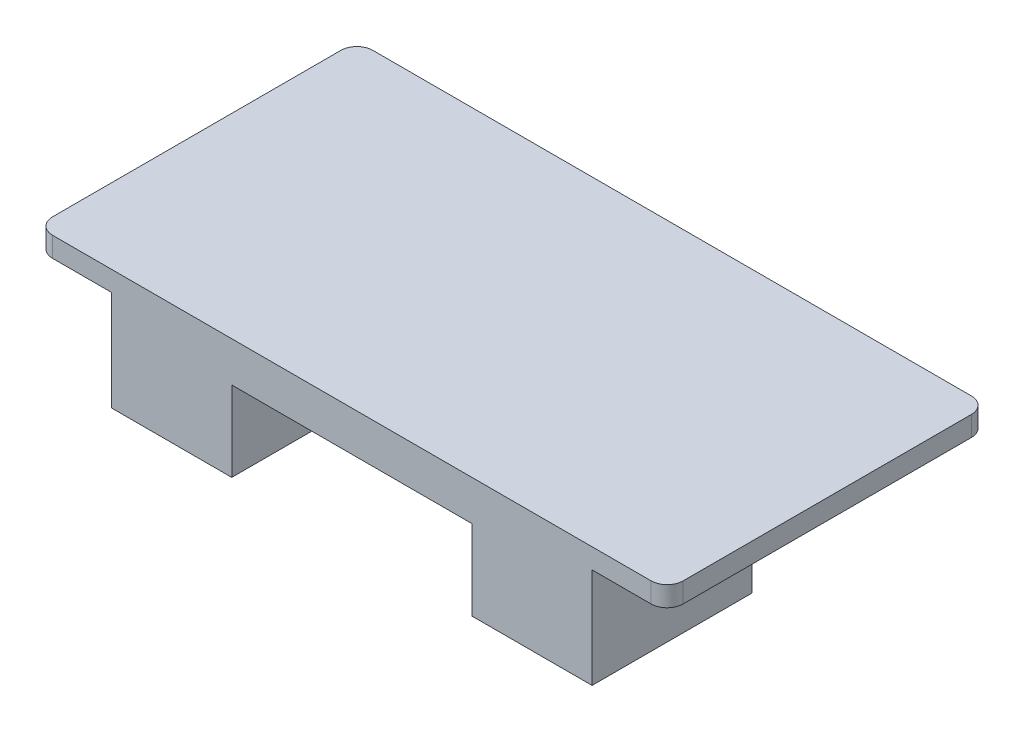
ISO-10303-21;
HEADER;
FILE_DESCRIPTION(('STEP AP214'),'2;1');
FILE_NAME('part.step','',(''),(''),'','','');
FILE_SCHEMA(('AUTOMOTIVE_DESIGN { 1 0 10303 214 1 1 1 1 }'));
ENDSEC;
DATA;
#1=APPLICATION_CONTEXT('core data for automotive mechanical design processes');
#2=APPLICATION_PROTOCOL_DEFINITION('international standard','automotive_design',2000,#1);
#3=PRODUCT_CONTEXT('',#1,'mechanical');
#4=PRODUCT('Part','Part','',(#3));
#5=PRODUCT_RELATED_PRODUCT_CATEGORY('part','',(#4));
#6=PRODUCT_DEFINITION_FORMATION('','',#4);
#7=PRODUCT_DEFINITION_CONTEXT('part definition',#1,'design');
#8=PRODUCT_DEFINITION('design','',#6,#7);
#9=PRODUCT_DEFINITION_SHAPE('','',#8);
#10=(LENGTH_UNIT() NAMED_UNIT(*) SI_UNIT(.MILLI.,.METRE.));
#11=(NAMED_UNIT(*) PLANE_ANGLE_UNIT() SI_UNIT($,.RADIAN.));
#12=(NAMED_UNIT(*) SI_UNIT($,.STERADIAN.) SOLID_ANGLE_UNIT());
#13=UNCERTAINTY_MEASURE_WITH_UNIT(LENGTH_MEASURE(1.E-05),#10,'distance_accuracy_value','');
#14=(GEOMETRIC_REPRESENTATION_CONTEXT(3) GLOBAL_UNCERTAINTY_ASSIGNED_CONTEXT((#13)) GLOBAL_UNIT_ASSIGNED_CONTEXT((#10,
#11,#12)) REPRESENTATION_CONTEXT('',''));
#15=CARTESIAN_POINT('',(0.,0.,0.));
#16=DIRECTION('',(0.,0.,1.));
#17=DIRECTION('',(1.,0.,0.));
#18=AXIS2_PLACEMENT_3D('',#15,#16,#17);
#19=CARTESIAN_POINT('',(0.,0.,0.));
#20=DIRECTION('',(0.,1.,0.));
#21=DIRECTION('',(0.,0.,1.));
#22=AXIS2_PLACEMENT_3D('',#19,#20,#21);
#23=PLANE('',#22);
#24=CARTESIAN_POINT('',(-52.5,0.,11.75));
#25=DIRECTION('',(0.,1.,0.));
#26=DIRECTION('',(0.,0.,1.));
#27=AXIS2_PLACEMENT_3D('',#24,#25,#26);
#28=CIRCLE('',#27,3.25);
#29=CARTESIAN_POINT('',(-52.5,0.,15.));
#30=VERTEX_POINT('',#29);
#31=EDGE_CURVE('E57',#30,#30,#28,.T.);
#32=ORIENTED_EDGE('',*,*,#31,.T.);
#33=EDGE_LOOP('',(#32));
#34=FACE_BOUND('',#33,.T.);
#35=CARTESIAN_POINT('',(-52.5,0.,-11.75));
#36=DIRECTION('',(0.,1.,0.));
#37=DIRECTION('',(0.,0.,1.));
#38=AXIS2_PLACEMENT_3D('',#35,#36,#37);
#39=CIRCLE('',#38,3.25);
#40=CARTESIAN_POINT('',(-52.5,0.,-8.5));
#41=VERTEX_POINT('',#40);
#42=EDGE_CURVE('E370',#41,#41,#39,.T.);
#43=ORIENTED_EDGE('',*,*,#42,.T.);
#44=EDGE_LOOP('',(#43));
#45=FACE_BOUND('',#44,.T.);
#46=DIRECTION('',(-1.,0.,0.));
#47=VECTOR('',#46,1.);
#48=CARTESIAN_POINT('',(-60.,0.,-20.));
#49=LINE('',#48,#47);
#50=CARTESIAN_POINT('',(-30.,0.,-20.));
#51=VERTEX_POINT('',#50);
#52=CARTESIAN_POINT('',(-60.,0.,-20.));
#53=VERTEX_POINT('',#52);
#54=EDGE_CURVE('E282',#51,#53,#49,.T.);
#55=ORIENTED_EDGE('',*,*,#54,.F.);
#56=DIRECTION('',(0.,0.,-1.));
#57=VECTOR('',#56,1.);
#58=CARTESIAN_POINT('',(-30.,0.,20.));
#59=LINE('',#58,#57);
#60=CARTESIAN_POINT('',(-30.,0.,20.));
#61=VERTEX_POINT('',#60);
#62=EDGE_CURVE('E169',#61,#51,#59,.T.);
#63=ORIENTED_EDGE('',*,*,#62,.F.);
#64=DIRECTION('',(1.,0.,0.));
#65=VECTOR('',#64,1.);
#66=CARTESIAN_POINT('',(-60.,0.,20.));
#67=LINE('',#66,#65);
#68=CARTESIAN_POINT('',(-60.,0.,20.));
#69=VERTEX_POINT('',#68);
#70=EDGE_CURVE('E275',#69,#61,#67,.T.);
#71=ORIENTED_EDGE('',*,*,#70,.F.);
#72=DIRECTION('',(0.,0.,1.));
#73=VECTOR('',#72,1.);
#74=CARTESIAN_POINT('',(-60.,0.,-20.));
#75=LINE('',#74,#73);
#76=EDGE_CURVE('E256',#53,#69,#75,.T.);
#77=ORIENTED_EDGE('',*,*,#76,.F.);
#78=EDGE_LOOP('',(#55,#63,#71,#77));
#79=FACE_BOUND('',#78,.T.);
#80=ADVANCED_FACE('F47',(#34,#45,#79),#23,.F.);
#81=CARTESIAN_POINT('',(-60.,25.,-20.));
#82=DIRECTION('',(1.,0.,0.));
#83=DIRECTION('',(0.,0.,-1.));
#84=AXIS2_PLACEMENT_3D('',#81,#82,#83);
#85=PLANE('',#84);
#86=ORIENTED_EDGE('',*,*,#76,.T.);
#87=DIRECTION('',(0.,-1.,0.));
#88=VECTOR('',#87,1.);
#89=CARTESIAN_POINT('',(-60.,25.,20.));
#90=LINE('',#89,#88);
#91=CARTESIAN_POINT('',(-60.,25.,20.));
#92=VERTEX_POINT('',#91);
#93=EDGE_CURVE('E296',#92,#69,#90,.T.);
#94=ORIENTED_EDGE('',*,*,#93,.F.);
#95=DIRECTION('',(0.,0.,1.));
#96=VECTOR('',#95,1.);
#97=CARTESIAN_POINT('',(-60.,25.,-20.));
#98=LINE('',#97,#96);
#99=CARTESIAN_POINT('',(-60.,25.,-20.));
#100=VERTEX_POINT('',#99);
#101=EDGE_CURVE('E257',#100,#92,#98,.T.);
#102=ORIENTED_EDGE('',*,*,#101,.F.);
#103=DIRECTION('',(0.,-1.,0.));
#104=VECTOR('',#103,1.);
#105=CARTESIAN_POINT('',(-60.,25.,-20.));
#106=LINE('',#105,#104);
#107=EDGE_CURVE('E270',#100,#53,#106,.T.);
#108=ORIENTED_EDGE('',*,*,#107,.T.);
#109=EDGE_LOOP('',(#86,#94,#102,#108));
#110=FACE_BOUND('',#109,.T.);
#111=ADVANCED_FACE('F411',(#110),#85,.F.);
#112=CARTESIAN_POINT('',(-60.,25.,20.));
#113=DIRECTION('',(0.,0.,-1.));
#114=DIRECTION('',(-1.,0.,0.));
#115=AXIS2_PLACEMENT_3D('',#112,#113,#114);
#116=PLANE('',#115);
#117=DIRECTION('',(1.,0.,0.));
#118=VECTOR('',#117,1.);
#119=CARTESIAN_POINT('',(-78.75,30.,20.));
#120=LINE('',#119,#118);
#121=CARTESIAN_POINT('',(-74.75,30.,20.));
#122=VERTEX_POINT('',#121);
#123=CARTESIAN_POINT('',(74.75,30.,20.));
#124=VERTEX_POINT('',#123);
#125=EDGE_CURVE('E216',#122,#124,#120,.T.);
#126=ORIENTED_EDGE('',*,*,#125,.F.);
#127=DIRECTION('',(0.,-1.,0.));
#128=VECTOR('',#127,1.);
#129=CARTESIAN_POINT('',(-74.75,25.,20.));
#130=LINE('',#129,#128);
#131=CARTESIAN_POINT('',(-74.75,25.,20.));
#132=VERTEX_POINT('',#131);
#133=EDGE_CURVE('E303',#122,#132,#130,.T.);
#134=ORIENTED_EDGE('',*,*,#133,.T.);
#135=DIRECTION('',(1.,0.,0.));
#136=VECTOR('',#135,1.);
#137=CARTESIAN_POINT('',(-78.75,25.,20.));
#138=LINE('',#137,#136);
#139=EDGE_CURVE('E232',#132,#92,#138,.T.);
#140=ORIENTED_EDGE('',*,*,#139,.T.);
#141=ORIENTED_EDGE('',*,*,#93,.T.);
#142=ORIENTED_EDGE('',*,*,#70,.T.);
#143=DIRECTION('',(0.,-1.,0.));
#144=VECTOR('',#143,1.);
#145=CARTESIAN_POINT('',(-30.,20.,20.));
#146=LINE('',#145,#144);
#147=CARTESIAN_POINT('',(-30.,20.,20.));
#148=VERTEX_POINT('',#147);
#149=EDGE_CURVE('E202',#148,#61,#146,.T.);
#150=ORIENTED_EDGE('',*,*,#149,.F.);
#151=DIRECTION('',(-1.,0.,0.));
#152=VECTOR('',#151,1.);
#153=CARTESIAN_POINT('',(-30.,20.,20.));
#154=LINE('',#153,#152);
#155=CARTESIAN_POINT('',(30.,20.,20.));
#156=VERTEX_POINT('',#155);
#157=EDGE_CURVE('E175',#156,#148,#154,.T.);
#158=ORIENTED_EDGE('',*,*,#157,.F.);
#159=DIRECTION('',(0.,-1.,0.));
#160=VECTOR('',#159,1.);
#161=CARTESIAN_POINT('',(30.,20.,20.));
#162=LINE('',#161,#160);
#163=CARTESIAN_POINT('',(30.,0.,20.));
#164=VERTEX_POINT('',#163);
#165=EDGE_CURVE('E206',#156,#164,#162,.T.);
#166=ORIENTED_EDGE('',*,*,#165,.T.);
#167=CARTESIAN_POINT('',(60.,0.,20.));
#168=VERTEX_POINT('',#167);
#169=EDGE_CURVE('E274',#164,#168,#67,.T.);
#170=ORIENTED_EDGE('',*,*,#169,.T.);
#171=DIRECTION('',(0.,-1.,0.));
#172=VECTOR('',#171,1.);
#173=CARTESIAN_POINT('',(60.,25.,20.));
#174=LINE('',#173,#172);
#175=CARTESIAN_POINT('',(60.,25.,20.));
#176=VERTEX_POINT('',#175);
#177=EDGE_CURVE('E292',#176,#168,#174,.T.);
#178=ORIENTED_EDGE('',*,*,#177,.F.);
#179=CARTESIAN_POINT('',(74.75,25.,20.));
#180=VERTEX_POINT('',#179);
#181=EDGE_CURVE('E231',#176,#180,#138,.T.);
#182=ORIENTED_EDGE('',*,*,#181,.T.);
#183=DIRECTION('',(0.,-1.,0.));
#184=VECTOR('',#183,1.);
#185=CARTESIAN_POINT('',(74.75,25.,20.));
#186=LINE('',#185,#184);
#187=EDGE_CURVE('E300',#180,#124,#186,.F.);
#188=ORIENTED_EDGE('',*,*,#187,.T.);
#189=EDGE_LOOP('',(#126,#134,#140,#141,#142,#150,#158,#166,#170,#178,#182,#188));
#190=FACE_BOUND('',#189,.T.);
#191=ADVANCED_FACE('F418',(#190),#116,.F.);
#192=CARTESIAN_POINT('',(60.,25.,-20.));
#193=DIRECTION('',(-1.,0.,0.));
#194=DIRECTION('',(0.,0.,1.));
#195=AXIS2_PLACEMENT_3D('',#192,#193,#194);
#196=PLANE('',#195);
#197=DIRECTION('',(0.,0.,-1.));
#198=VECTOR('',#197,1.);
#199=CARTESIAN_POINT('',(60.,0.,-20.));
#200=LINE('',#199,#198);
#201=CARTESIAN_POINT('',(60.,0.,-20.));
#202=VERTEX_POINT('',#201);
#203=EDGE_CURVE('E279',#168,#202,#200,.T.);
#204=ORIENTED_EDGE('',*,*,#203,.T.);
#205=DIRECTION('',(0.,-1.,0.));
#206=VECTOR('',#205,1.);
#207=CARTESIAN_POINT('',(60.,25.,-20.));
#208=LINE('',#207,#206);
#209=CARTESIAN_POINT('',(60.,25.,-20.));
#210=VERTEX_POINT('',#209);
#211=EDGE_CURVE('E288',#210,#202,#208,.T.);
#212=ORIENTED_EDGE('',*,*,#211,.F.);
#213=DIRECTION('',(0.,0.,-1.));
#214=VECTOR('',#213,1.);
#215=CARTESIAN_POINT('',(60.,25.,-20.));
#216=LINE('',#215,#214);
#217=EDGE_CURVE('E261',#176,#210,#216,.T.);
#218=ORIENTED_EDGE('',*,*,#217,.F.);
#219=ORIENTED_EDGE('',*,*,#177,.T.);
#220=EDGE_LOOP('',(#204,#212,#218,#219));
#221=FACE_BOUND('',#220,.T.);
#222=ADVANCED_FACE('F426',(#221),#196,.F.);
#223=CARTESIAN_POINT('',(-60.,25.,-20.));
#224=DIRECTION('',(0.,0.,1.));
#225=DIRECTION('',(1.,0.,0.));
#226=AXIS2_PLACEMENT_3D('',#223,#224,#225);
#227=PLANE('',#226);
#228=DIRECTION('',(1.,0.,0.));
#229=VECTOR('',#228,1.);
#230=CARTESIAN_POINT('',(-30.,20.,-20.));
#231=LINE('',#230,#229);
#232=CARTESIAN_POINT('',(-30.,20.,-20.));
#233=VERTEX_POINT('',#232);
#234=CARTESIAN_POINT('',(30.,20.,-20.));
#235=VERTEX_POINT('',#234);
#236=EDGE_CURVE('E181',#233,#235,#231,.T.);
#237=ORIENTED_EDGE('',*,*,#236,.F.);
#238=DIRECTION('',(0.,-1.,0.));
#239=VECTOR('',#238,1.);
#240=CARTESIAN_POINT('',(-30.,20.,-20.));
#241=LINE('',#240,#239);
#242=EDGE_CURVE('E163',#233,#51,#241,.T.);
#243=ORIENTED_EDGE('',*,*,#242,.T.);
#244=ORIENTED_EDGE('',*,*,#54,.T.);
#245=ORIENTED_EDGE('',*,*,#107,.F.);
#246=DIRECTION('',(-1.,0.,0.));
#247=VECTOR('',#246,1.);
#248=CARTESIAN_POINT('',(-60.,25.,-20.));
#249=LINE('',#248,#247);
#250=EDGE_CURVE('E266',#210,#100,#249,.T.);
#251=ORIENTED_EDGE('',*,*,#250,.F.);
#252=ORIENTED_EDGE('',*,*,#211,.T.);
#253=CARTESIAN_POINT('',(30.,0.,-20.));
#254=VERTEX_POINT('',#253);
#255=EDGE_CURVE('E262',#202,#254,#49,.T.);
#256=ORIENTED_EDGE('',*,*,#255,.T.);
#257=DIRECTION('',(0.,-1.,0.));
#258=VECTOR('',#257,1.);
#259=CARTESIAN_POINT('',(30.,20.,-20.));
#260=LINE('',#259,#258);
#261=EDGE_CURVE('E174',#235,#254,#260,.T.);
#262=ORIENTED_EDGE('',*,*,#261,.F.);
#263=EDGE_LOOP('',(#237,#243,#244,#245,#251,#252,#256,#262));
#264=FACE_BOUND('',#263,.T.);
#265=ADVANCED_FACE('F188',(#264),#227,.F.);
#266=CARTESIAN_POINT('',(52.5,0.,11.75));
#267=DIRECTION('',(0.,1.,0.));
#268=DIRECTION('',(0.,0.,1.));
#269=AXIS2_PLACEMENT_3D('',#266,#267,#268);
#270=CIRCLE('',#269,3.25);
#271=CARTESIAN_POINT('',(52.5,0.,15.));
#272=VERTEX_POINT('',#271);
#273=EDGE_CURVE('E358',#272,#272,#270,.T.);
#274=ORIENTED_EDGE('',*,*,#273,.T.);
#275=EDGE_LOOP('',(#274));
#276=FACE_BOUND('',#275,.T.);
#277=CARTESIAN_POINT('',(52.5,0.,-11.75));
#278=DIRECTION('',(0.,1.,0.));
#279=DIRECTION('',(0.,0.,1.));
#280=AXIS2_PLACEMENT_3D('',#277,#278,#279);
#281=CIRCLE('',#280,3.25);
#282=CARTESIAN_POINT('',(52.5,0.,-8.5));
#283=VERTEX_POINT('',#282);
#284=EDGE_CURVE('E354',#283,#283,#281,.T.);
#285=ORIENTED_EDGE('',*,*,#284,.T.);
#286=EDGE_LOOP('',(#285));
#287=FACE_BOUND('',#286,.T.);
#288=ORIENTED_EDGE('',*,*,#169,.F.);
#289=DIRECTION('',(0.,0.,1.));
#290=VECTOR('',#289,1.);
#291=CARTESIAN_POINT('',(30.,0.,20.));
#292=LINE('',#291,#290);
#293=EDGE_CURVE('E186',#254,#164,#292,.T.);
#294=ORIENTED_EDGE('',*,*,#293,.F.);
#295=ORIENTED_EDGE('',*,*,#255,.F.);
#296=ORIENTED_EDGE('',*,*,#203,.F.);
#297=EDGE_LOOP('',(#288,#294,#295,#296));
#298=FACE_BOUND('',#297,.T.);
#299=ADVANCED_FACE('F389',(#276,#287,#298),#23,.F.);
#300=CARTESIAN_POINT('',(-52.5,25.,11.75));
#301=DIRECTION('',(0.,-1.,0.));
#302=DIRECTION('',(0.,0.,-1.));
#303=AXIS2_PLACEMENT_3D('',#300,#301,#302);
#304=CYLINDRICAL_SURFACE('',#303,2.75);
#305=CARTESIAN_POINT('',(-52.5,0.500000000000011,11.75));
#306=DIRECTION('',(0.,1.,0.));
#307=DIRECTION('',(0.,0.,1.));
#308=AXIS2_PLACEMENT_3D('',#305,#306,#307);
#309=CIRCLE('',#308,2.75);
#310=CARTESIAN_POINT('',(-52.5,0.500000000000011,14.5));
#311=VERTEX_POINT('',#310);
#312=EDGE_CURVE('E366',#311,#311,#309,.F.);
#313=ORIENTED_EDGE('',*,*,#312,.T.);
#314=EDGE_LOOP('',(#313));
#315=FACE_BOUND('',#314,.T.);
#316=CARTESIAN_POINT('',(-52.5,25.,11.75));
#317=DIRECTION('',(0.,-1.,0.));
#318=DIRECTION('',(0.,0.,-1.));
#319=AXIS2_PLACEMENT_3D('',#316,#317,#318);
#320=CIRCLE('',#319,2.75);
#321=CARTESIAN_POINT('',(-52.5,25.,9.));
#322=VERTEX_POINT('',#321);
#323=EDGE_CURVE('E245',#322,#322,#320,.T.);
#324=ORIENTED_EDGE('',*,*,#323,.F.);
#325=EDGE_LOOP('',(#324));
#326=FACE_BOUND('',#325,.T.);
#327=ADVANCED_FACE('F385',(#315,#326),#304,.F.);
#328=CARTESIAN_POINT('',(-52.5,25.,-11.75));
#329=DIRECTION('',(0.,-1.,0.));
#330=DIRECTION('',(0.,0.,-1.));
#331=AXIS2_PLACEMENT_3D('',#328,#329,#330);
#332=CYLINDRICAL_SURFACE('',#331,2.75);
#333=CARTESIAN_POINT('',(-52.5,0.500000000000011,-11.75));
#334=DIRECTION('',(0.,1.,0.));
#335=DIRECTION('',(0.,0.,1.));
#336=AXIS2_PLACEMENT_3D('',#333,#334,#335);
#337=CIRCLE('',#336,2.75);
#338=CARTESIAN_POINT('',(-52.5,0.500000000000011,-9.));
#339=VERTEX_POINT('',#338);
#340=EDGE_CURVE('E11',#339,#339,#337,.F.);
#341=ORIENTED_EDGE('',*,*,#340,.T.);
#342=EDGE_LOOP('',(#341));
#343=FACE_BOUND('',#342,.T.);
#344=CARTESIAN_POINT('',(-52.5,25.,-11.75));
#345=DIRECTION('',(0.,-1.,0.));
#346=DIRECTION('',(0.,0.,-1.));
#347=AXIS2_PLACEMENT_3D('',#344,#345,#346);
#348=CIRCLE('',#347,2.75);
#349=CARTESIAN_POINT('',(-52.5,25.,-14.5));
#350=VERTEX_POINT('',#349);
#351=EDGE_CURVE('E241',#350,#350,#348,.T.);
#352=ORIENTED_EDGE('',*,*,#351,.F.);
#353=EDGE_LOOP('',(#352));
#354=FACE_BOUND('',#353,.T.);
#355=ADVANCED_FACE('F388',(#343,#354),#332,.F.);
#356=CARTESIAN_POINT('',(52.5,25.,-11.75));
#357=DIRECTION('',(0.,-1.,0.));
#358=DIRECTION('',(0.,0.,-1.));
#359=AXIS2_PLACEMENT_3D('',#356,#357,#358);
#360=CYLINDRICAL_SURFACE('',#359,2.75);
#361=CARTESIAN_POINT('',(52.5,0.500000000000011,-11.75));
#362=DIRECTION('',(0.,1.,0.));
#363=DIRECTION('',(0.,0.,1.));
#364=AXIS2_PLACEMENT_3D('',#361,#362,#363);
#365=CIRCLE('',#364,2.75);
#366=CARTESIAN_POINT('',(52.5,0.500000000000011,-9.));
#367=VERTEX_POINT('',#366);
#368=EDGE_CURVE('E362',#367,#367,#365,.F.);
#369=ORIENTED_EDGE('',*,*,#368,.T.);
#370=EDGE_LOOP('',(#369));
#371=FACE_BOUND('',#370,.T.);
#372=CARTESIAN_POINT('',(52.5,25.,-11.75));
#373=DIRECTION('',(0.,-1.,0.));
#374=DIRECTION('',(0.,0.,-1.));
#375=AXIS2_PLACEMENT_3D('',#372,#373,#374);
#376=CIRCLE('',#375,2.75);
#377=CARTESIAN_POINT('',(52.5,25.,-14.5));
#378=VERTEX_POINT('',#377);
#379=EDGE_CURVE('E246',#378,#378,#376,.T.);
#380=ORIENTED_EDGE('',*,*,#379,.F.);
#381=EDGE_LOOP('',(#380));
#382=FACE_BOUND('',#381,.T.);
#383=ADVANCED_FACE('F494',(#371,#382),#360,.F.);
#384=CARTESIAN_POINT('',(52.5,25.,11.75));
#385=DIRECTION('',(0.,-1.,0.));
#386=DIRECTION('',(0.,0.,-1.));
#387=AXIS2_PLACEMENT_3D('',#384,#385,#386);
#388=CYLINDRICAL_SURFACE('',#387,2.75);
#389=CARTESIAN_POINT('',(52.5,0.500000000000011,11.75));
#390=DIRECTION('',(0.,1.,0.));
#391=DIRECTION('',(0.,0.,1.));
#392=AXIS2_PLACEMENT_3D('',#389,#390,#391);
#393=CIRCLE('',#392,2.75);
#394=CARTESIAN_POINT('',(52.5,0.500000000000011,14.5));
#395=VERTEX_POINT('',#394);
#396=EDGE_CURVE('E350',#395,#395,#393,.F.);
#397=ORIENTED_EDGE('',*,*,#396,.T.);
#398=EDGE_LOOP('',(#397));
#399=FACE_BOUND('',#398,.T.);
#400=CARTESIAN_POINT('',(52.5,25.,11.75));
#401=DIRECTION('',(0.,-1.,0.));
#402=DIRECTION('',(0.,0.,-1.));
#403=AXIS2_PLACEMENT_3D('',#400,#401,#402);
#404=CIRCLE('',#403,2.75);
#405=CARTESIAN_POINT('',(52.5,25.,9.));
#406=VERTEX_POINT('',#405);
#407=EDGE_CURVE('E227',#406,#406,#404,.T.);
#408=ORIENTED_EDGE('',*,*,#407,.F.);
#409=EDGE_LOOP('',(#408));
#410=FACE_BOUND('',#409,.T.);
#411=ADVANCED_FACE('F488',(#399,#410),#388,.F.);
#412=CARTESIAN_POINT('',(0.,30.,0.));
#413=DIRECTION('',(0.,1.,0.));
#414=DIRECTION('',(0.,0.,1.));
#415=AXIS2_PLACEMENT_3D('',#412,#413,#414);
#416=PLANE('',#415);
#417=DIRECTION('',(0.,0.,1.));
#418=VECTOR('',#417,1.);
#419=CARTESIAN_POINT('',(-78.75,30.,-60.));
#420=LINE('',#419,#418);
#421=CARTESIAN_POINT('',(-78.75,30.,-56.));
#422=VERTEX_POINT('',#421);
#423=CARTESIAN_POINT('',(-78.75,30.,16.));
#424=VERTEX_POINT('',#423);
#425=EDGE_CURVE('E212',#422,#424,#420,.T.);
#426=ORIENTED_EDGE('',*,*,#425,.T.);
#427=CARTESIAN_POINT('',(-74.75,30.,16.));
#428=DIRECTION('',(0.,1.,0.));
#429=DIRECTION('',(0.,0.,1.));
#430=AXIS2_PLACEMENT_3D('',#427,#428,#429);
#431=CIRCLE('',#430,4.);
#432=EDGE_CURVE('E334',#424,#122,#431,.T.);
#433=ORIENTED_EDGE('',*,*,#432,.T.);
#434=ORIENTED_EDGE('',*,*,#125,.T.);
#435=CARTESIAN_POINT('',(74.75,30.,16.));
#436=DIRECTION('',(0.,1.,0.));
#437=DIRECTION('',(0.,0.,1.));
#438=AXIS2_PLACEMENT_3D('',#435,#436,#437);
#439=CIRCLE('',#438,4.);
#440=CARTESIAN_POINT('',(78.75,30.,16.));
#441=VERTEX_POINT('',#440);
#442=EDGE_CURVE('E328',#124,#441,#439,.T.);
#443=ORIENTED_EDGE('',*,*,#442,.T.);
#444=DIRECTION('',(0.,0.,-1.));
#445=VECTOR('',#444,1.);
#446=CARTESIAN_POINT('',(78.75,30.,-60.));
#447=LINE('',#446,#445);
#448=CARTESIAN_POINT('',(78.75,30.,-56.));
#449=VERTEX_POINT('',#448);
#450=EDGE_CURVE('E221',#441,#449,#447,.T.);
#451=ORIENTED_EDGE('',*,*,#450,.T.);
#452=CARTESIAN_POINT('',(74.75,30.,-56.));
#453=DIRECTION('',(0.,1.,0.));
#454=DIRECTION('',(0.,0.,1.));
#455=AXIS2_PLACEMENT_3D('',#452,#453,#454);
#456=CIRCLE('',#455,4.);
#457=CARTESIAN_POINT('',(74.75,30.,-60.));
#458=VERTEX_POINT('',#457);
#459=EDGE_CURVE('E71',#449,#458,#456,.T.);
#460=ORIENTED_EDGE('',*,*,#459,.T.);
#461=DIRECTION('',(-1.,0.,0.));
#462=VECTOR('',#461,1.);
#463=CARTESIAN_POINT('',(-78.75,30.,-60.));
#464=LINE('',#463,#462);
#465=CARTESIAN_POINT('',(-74.75,30.,-60.));
#466=VERTEX_POINT('',#465);
#467=EDGE_CURVE('E224',#458,#466,#464,.T.);
#468=ORIENTED_EDGE('',*,*,#467,.T.);
#469=CARTESIAN_POINT('',(-74.75,30.,-56.));
#470=DIRECTION('',(0.,1.,0.));
#471=DIRECTION('',(0.,0.,1.));
#472=AXIS2_PLACEMENT_3D('',#469,#470,#471);
#473=CIRCLE('',#472,4.);
#474=EDGE_CURVE('E331',#466,#422,#473,.T.);
#475=ORIENTED_EDGE('',*,*,#474,.T.);
#476=EDGE_LOOP('',(#426,#433,#434,#443,#451,#460,#468,#475));
#477=FACE_BOUND('',#476,.T.);
#478=ADVANCED_FACE('F448',(#477),#416,.T.);
#479=CARTESIAN_POINT('',(-78.75,30.,-60.));
#480=DIRECTION('',(0.,0.,1.));
#481=DIRECTION('',(1.,0.,0.));
#482=AXIS2_PLACEMENT_3D('',#479,#480,#481);
#483=PLANE('',#482);
#484=DIRECTION('',(-1.,0.,0.));
#485=VECTOR('',#484,1.);
#486=CARTESIAN_POINT('',(-78.75,25.,-60.));
#487=LINE('',#486,#485);
#488=CARTESIAN_POINT('',(74.75,25.,-60.));
#489=VERTEX_POINT('',#488);
#490=CARTESIAN_POINT('',(-74.75,25.,-60.));
#491=VERTEX_POINT('',#490);
#492=EDGE_CURVE('E217',#489,#491,#487,.T.);
#493=ORIENTED_EDGE('',*,*,#492,.T.);
#494=DIRECTION('',(0.,-1.,0.));
#495=VECTOR('',#494,1.);
#496=CARTESIAN_POINT('',(-74.75,30.,-60.));
#497=LINE('',#496,#495);
#498=EDGE_CURVE('E64',#491,#466,#497,.F.);
#499=ORIENTED_EDGE('',*,*,#498,.T.);
#500=ORIENTED_EDGE('',*,*,#467,.F.);
#501=DIRECTION('',(0.,-1.,0.));
#502=VECTOR('',#501,1.);
#503=CARTESIAN_POINT('',(74.75,30.,-60.));
#504=LINE('',#503,#502);
#505=EDGE_CURVE('E337',#458,#489,#504,.T.);
#506=ORIENTED_EDGE('',*,*,#505,.T.);
#507=EDGE_LOOP('',(#493,#499,#500,#506));
#508=FACE_BOUND('',#507,.T.);
#509=ADVANCED_FACE('F457',(#508),#483,.F.);
#510=CARTESIAN_POINT('',(78.75,30.,-60.));
#511=DIRECTION('',(-1.,0.,0.));
#512=DIRECTION('',(0.,0.,1.));
#513=AXIS2_PLACEMENT_3D('',#510,#511,#512);
#514=PLANE('',#513);
#515=ORIENTED_EDGE('',*,*,#450,.F.);
#516=DIRECTION('',(0.,-1.,0.));
#517=VECTOR('',#516,1.);
#518=CARTESIAN_POINT('',(78.75,30.,16.));
#519=LINE('',#518,#517);
#520=CARTESIAN_POINT('',(78.75,25.,16.));
#521=VERTEX_POINT('',#520);
#522=EDGE_CURVE('E346',#441,#521,#519,.T.);
#523=ORIENTED_EDGE('',*,*,#522,.T.);
#524=DIRECTION('',(0.,0.,-1.));
#525=VECTOR('',#524,1.);
#526=CARTESIAN_POINT('',(78.75,25.,-60.));
#527=LINE('',#526,#525);
#528=CARTESIAN_POINT('',(78.75,25.,-56.));
#529=VERTEX_POINT('',#528);
#530=EDGE_CURVE('E235',#521,#529,#527,.T.);
#531=ORIENTED_EDGE('',*,*,#530,.T.);
#532=DIRECTION('',(0.,-1.,0.));
#533=VECTOR('',#532,1.);
#534=CARTESIAN_POINT('',(78.75,30.,-56.));
#535=LINE('',#534,#533);
#536=EDGE_CURVE('E343',#529,#449,#535,.F.);
#537=ORIENTED_EDGE('',*,*,#536,.T.);
#538=EDGE_LOOP('',(#515,#523,#531,#537));
#539=FACE_BOUND('',#538,.T.);
#540=ADVANCED_FACE('F450',(#539),#514,.F.);
#541=CARTESIAN_POINT('',(-78.75,30.,-60.));
#542=DIRECTION('',(1.,0.,0.));
#543=DIRECTION('',(0.,0.,-1.));
#544=AXIS2_PLACEMENT_3D('',#541,#542,#543);
#545=PLANE('',#544);
#546=DIRECTION('',(0.,0.,1.));
#547=VECTOR('',#546,1.);
#548=CARTESIAN_POINT('',(-78.75,25.,-60.));
#549=LINE('',#548,#547);
#550=CARTESIAN_POINT('',(-78.75,25.,-56.));
#551=VERTEX_POINT('',#550);
#552=CARTESIAN_POINT('',(-78.75,25.,16.));
#553=VERTEX_POINT('',#552);
#554=EDGE_CURVE('E205',#551,#553,#549,.T.);
#555=ORIENTED_EDGE('',*,*,#554,.T.);
#556=DIRECTION('',(0.,-1.,0.));
#557=VECTOR('',#556,1.);
#558=CARTESIAN_POINT('',(-78.75,30.,16.));
#559=LINE('',#558,#557);
#560=EDGE_CURVE('E323',#553,#424,#559,.F.);
#561=ORIENTED_EDGE('',*,*,#560,.T.);
#562=ORIENTED_EDGE('',*,*,#425,.F.);
#563=DIRECTION('',(0.,-1.,0.));
#564=VECTOR('',#563,1.);
#565=CARTESIAN_POINT('',(-78.75,30.,-56.));
#566=LINE('',#565,#564);
#567=EDGE_CURVE('E319',#422,#551,#566,.T.);
#568=ORIENTED_EDGE('',*,*,#567,.T.);
#569=EDGE_LOOP('',(#555,#561,#562,#568));
#570=FACE_BOUND('',#569,.T.);
#571=ADVANCED_FACE('F405',(#570),#545,.F.);
#572=CARTESIAN_POINT('',(0.,25.,0.));
#573=DIRECTION('',(0.,1.,0.));
#574=DIRECTION('',(0.,0.,1.));
#575=AXIS2_PLACEMENT_3D('',#572,#573,#574);
#576=PLANE('',#575);
#577=ORIENTED_EDGE('',*,*,#139,.F.);
#578=CARTESIAN_POINT('',(-74.75,25.,16.));
#579=DIRECTION('',(0.,1.,0.));
#580=DIRECTION('',(0.,0.,1.));
#581=AXIS2_PLACEMENT_3D('',#578,#579,#580);
#582=CIRCLE('',#581,4.);
#583=EDGE_CURVE('E316',#132,#553,#582,.F.);
#584=ORIENTED_EDGE('',*,*,#583,.T.);
#585=ORIENTED_EDGE('',*,*,#554,.F.);
#586=CARTESIAN_POINT('',(-74.75,25.,-56.));
#587=DIRECTION('',(0.,1.,0.));
#588=DIRECTION('',(0.,0.,1.));
#589=AXIS2_PLACEMENT_3D('',#586,#587,#588);
#590=CIRCLE('',#589,4.);
#591=EDGE_CURVE('E313',#551,#491,#590,.F.);
#592=ORIENTED_EDGE('',*,*,#591,.T.);
#593=ORIENTED_EDGE('',*,*,#492,.F.);
#594=CARTESIAN_POINT('',(74.75,25.,-56.));
#595=DIRECTION('',(0.,1.,0.));
#596=DIRECTION('',(0.,0.,1.));
#597=AXIS2_PLACEMENT_3D('',#594,#595,#596);
#598=CIRCLE('',#597,4.);
#599=EDGE_CURVE('E307',#489,#529,#598,.F.);
#600=ORIENTED_EDGE('',*,*,#599,.T.);
#601=ORIENTED_EDGE('',*,*,#530,.F.);
#602=CARTESIAN_POINT('',(74.75,25.,16.));
#603=DIRECTION('',(0.,1.,0.));
#604=DIRECTION('',(0.,0.,1.));
#605=AXIS2_PLACEMENT_3D('',#602,#603,#604);
#606=CIRCLE('',#605,4.);
#607=EDGE_CURVE('E310',#521,#180,#606,.F.);
#608=ORIENTED_EDGE('',*,*,#607,.T.);
#609=ORIENTED_EDGE('',*,*,#181,.F.);
#610=ORIENTED_EDGE('',*,*,#217,.T.);
#611=ORIENTED_EDGE('',*,*,#250,.T.);
#612=ORIENTED_EDGE('',*,*,#101,.T.);
#613=EDGE_LOOP('',(#577,#584,#585,#592,#593,#600,#601,#608,#609,#610,#611,#612));
#614=FACE_BOUND('',#613,.T.);
#615=ADVANCED_FACE('F396',(#614),#576,.F.);
#616=ORIENTED_EDGE('',*,*,#323,.T.);
#617=EDGE_LOOP('',(#616));
#618=FACE_BOUND('',#617,.T.);
#619=ADVANCED_FACE('F393',(#618),#576,.F.);
#620=ORIENTED_EDGE('',*,*,#351,.T.);
#621=EDGE_LOOP('',(#620));
#622=FACE_BOUND('',#621,.T.);
#623=ADVANCED_FACE('F395',(#622),#576,.F.);
#624=ORIENTED_EDGE('',*,*,#379,.T.);
#625=EDGE_LOOP('',(#624));
#626=FACE_BOUND('',#625,.T.);
#627=ADVANCED_FACE('F402',(#626),#576,.F.);
#628=ORIENTED_EDGE('',*,*,#407,.T.);
#629=EDGE_LOOP('',(#628));
#630=FACE_BOUND('',#629,.T.);
#631=ADVANCED_FACE('F407',(#630),#576,.F.);
#632=CARTESIAN_POINT('',(-30.,20.,20.));
#633=DIRECTION('',(-1.,0.,0.));
#634=DIRECTION('',(0.,0.,1.));
#635=AXIS2_PLACEMENT_3D('',#632,#633,#634);
#636=PLANE('',#635);
#637=ORIENTED_EDGE('',*,*,#62,.T.);
#638=ORIENTED_EDGE('',*,*,#242,.F.);
#639=DIRECTION('',(0.,0.,-1.));
#640=VECTOR('',#639,1.);
#641=CARTESIAN_POINT('',(-30.,20.,20.));
#642=LINE('',#641,#640);
#643=EDGE_CURVE('E166',#148,#233,#642,.T.);
#644=ORIENTED_EDGE('',*,*,#643,.F.);
#645=ORIENTED_EDGE('',*,*,#149,.T.);
#646=EDGE_LOOP('',(#637,#638,#644,#645));
#647=FACE_BOUND('',#646,.T.);
#648=ADVANCED_FACE('F165',(#647),#636,.F.);
#649=CARTESIAN_POINT('',(30.,20.,20.));
#650=DIRECTION('',(1.,0.,0.));
#651=DIRECTION('',(0.,0.,-1.));
#652=AXIS2_PLACEMENT_3D('',#649,#650,#651);
#653=PLANE('',#652);
#654=ORIENTED_EDGE('',*,*,#293,.T.);
#655=ORIENTED_EDGE('',*,*,#165,.F.);
#656=DIRECTION('',(0.,0.,1.));
#657=VECTOR('',#656,1.);
#658=CARTESIAN_POINT('',(30.,20.,20.));
#659=LINE('',#658,#657);
#660=EDGE_CURVE('E191',#235,#156,#659,.T.);
#661=ORIENTED_EDGE('',*,*,#660,.F.);
#662=ORIENTED_EDGE('',*,*,#261,.T.);
#663=EDGE_LOOP('',(#654,#655,#661,#662));
#664=FACE_BOUND('',#663,.T.);
#665=ADVANCED_FACE('F478',(#664),#653,.F.);
#666=CARTESIAN_POINT('',(0.,20.,0.));
#667=DIRECTION('',(0.,-1.,0.));
#668=DIRECTION('',(0.,0.,-1.));
#669=AXIS2_PLACEMENT_3D('',#666,#667,#668);
#670=PLANE('',#669);
#671=ORIENTED_EDGE('',*,*,#643,.T.);
#672=ORIENTED_EDGE('',*,*,#236,.T.);
#673=ORIENTED_EDGE('',*,*,#660,.T.);
#674=ORIENTED_EDGE('',*,*,#157,.T.);
#675=EDGE_LOOP('',(#671,#672,#673,#674));
#676=FACE_BOUND('',#675,.T.);
#677=ADVANCED_FACE('F179',(#676),#670,.T.);
#678=CARTESIAN_POINT('',(-74.75,25.,16.));
#679=DIRECTION('',(0.,-1.,0.));
#680=DIRECTION('',(0.,0.,-1.));
#681=AXIS2_PLACEMENT_3D('',#678,#679,#680);
#682=CYLINDRICAL_SURFACE('',#681,4.);
#683=ORIENTED_EDGE('',*,*,#432,.F.);
#684=ORIENTED_EDGE('',*,*,#560,.F.);
#685=ORIENTED_EDGE('',*,*,#583,.F.);
#686=ORIENTED_EDGE('',*,*,#133,.F.);
#687=EDGE_LOOP('',(#683,#684,#685,#686));
#688=FACE_BOUND('',#687,.T.);
#689=ADVANCED_FACE('F470',(#688),#682,.T.);
#690=CARTESIAN_POINT('',(-74.75,30.,-56.));
#691=DIRECTION('',(0.,-1.,0.));
#692=DIRECTION('',(0.,0.,-1.));
#693=AXIS2_PLACEMENT_3D('',#690,#691,#692);
#694=CYLINDRICAL_SURFACE('',#693,4.);
#695=ORIENTED_EDGE('',*,*,#474,.F.);
#696=ORIENTED_EDGE('',*,*,#498,.F.);
#697=ORIENTED_EDGE('',*,*,#591,.F.);
#698=ORIENTED_EDGE('',*,*,#567,.F.);
#699=EDGE_LOOP('',(#695,#696,#697,#698));
#700=FACE_BOUND('',#699,.T.);
#701=ADVANCED_FACE('F463',(#700),#694,.T.);
#702=CARTESIAN_POINT('',(74.75,30.,16.));
#703=DIRECTION('',(0.,-1.,0.));
#704=DIRECTION('',(0.,0.,-1.));
#705=AXIS2_PLACEMENT_3D('',#702,#703,#704);
#706=CYLINDRICAL_SURFACE('',#705,4.);
#707=ORIENTED_EDGE('',*,*,#442,.F.);
#708=ORIENTED_EDGE('',*,*,#187,.F.);
#709=ORIENTED_EDGE('',*,*,#607,.F.);
#710=ORIENTED_EDGE('',*,*,#522,.F.);
#711=EDGE_LOOP('',(#707,#708,#709,#710));
#712=FACE_BOUND('',#711,.T.);
#713=ADVANCED_FACE('F445',(#712),#706,.T.);
#714=CARTESIAN_POINT('',(74.75,30.,-56.));
#715=DIRECTION('',(0.,-1.,0.));
#716=DIRECTION('',(0.,0.,-1.));
#717=AXIS2_PLACEMENT_3D('',#714,#715,#716);
#718=CYLINDRICAL_SURFACE('',#717,4.);
#719=ORIENTED_EDGE('',*,*,#459,.F.);
#720=ORIENTED_EDGE('',*,*,#536,.F.);
#721=ORIENTED_EDGE('',*,*,#599,.F.);
#722=ORIENTED_EDGE('',*,*,#505,.F.);
#723=EDGE_LOOP('',(#719,#720,#721,#722));
#724=FACE_BOUND('',#723,.T.);
#725=ADVANCED_FACE('F454',(#724),#718,.T.);
#726=CARTESIAN_POINT('',(52.5,0.500000000000011,11.75));
#727=DIRECTION('',(0.,-1.,0.));
#728=DIRECTION('',(0.,0.,-1.));
#729=AXIS2_PLACEMENT_3D('',#726,#727,#728);
#730=CONICAL_SURFACE('',#729,2.75,0.785398163397439);
#731=ORIENTED_EDGE('',*,*,#273,.F.);
#732=EDGE_LOOP('',(#731));
#733=FACE_BOUND('',#732,.T.);
#734=ORIENTED_EDGE('',*,*,#396,.F.);
#735=EDGE_LOOP('',(#734));
#736=FACE_BOUND('',#735,.T.);
#737=ADVANCED_FACE('F552',(#733,#736),#730,.F.);
#738=CARTESIAN_POINT('',(52.5,0.500000000000011,-11.75));
#739=DIRECTION('',(0.,-1.,0.));
#740=DIRECTION('',(0.,0.,-1.));
#741=AXIS2_PLACEMENT_3D('',#738,#739,#740);
#742=CONICAL_SURFACE('',#741,2.75,0.785398163397437);
#743=ORIENTED_EDGE('',*,*,#284,.F.);
#744=EDGE_LOOP('',(#743));
#745=FACE_BOUND('',#744,.T.);
#746=ORIENTED_EDGE('',*,*,#368,.F.);
#747=EDGE_LOOP('',(#746));
#748=FACE_BOUND('',#747,.T.);
#749=ADVANCED_FACE('F382',(#745,#748),#742,.F.);
#750=CARTESIAN_POINT('',(-52.5,0.500000000000011,11.75));
#751=DIRECTION('',(0.,-1.,0.));
#752=DIRECTION('',(0.,0.,-1.));
#753=AXIS2_PLACEMENT_3D('',#750,#751,#752);
#754=CONICAL_SURFACE('',#753,2.75,0.785398163397437);
#755=ORIENTED_EDGE('',*,*,#31,.F.);
#756=EDGE_LOOP('',(#755));
#757=FACE_BOUND('',#756,.T.);
#758=ORIENTED_EDGE('',*,*,#312,.F.);
#759=EDGE_LOOP('',(#758));
#760=FACE_BOUND('',#759,.T.);
#761=ADVANCED_FACE('F379',(#757,#760),#754,.F.);
#762=CARTESIAN_POINT('',(-52.5,0.500000000000011,-11.75));
#763=DIRECTION('',(0.,-1.,0.));
#764=DIRECTION('',(0.,0.,-1.));
#765=AXIS2_PLACEMENT_3D('',#762,#763,#764);
#766=CONICAL_SURFACE('',#765,2.75,0.785398163397437);
#767=ORIENTED_EDGE('',*,*,#42,.F.);
#768=EDGE_LOOP('',(#767));
#769=FACE_BOUND('',#768,.T.);
#770=ORIENTED_EDGE('',*,*,#340,.F.);
#771=EDGE_LOOP('',(#770));
#772=FACE_BOUND('',#771,.T.);
#773=ADVANCED_FACE('F50',(#769,#772),#766,.F.);
#774=CLOSED_SHELL('',(#80,#111,#191,#222,#265,#299,#327,#355,#383,#411,#478,#509,#540,#571,#615,
#619,#623,#627,#631,#648,#665,#677,#689,#701,#713,#725,#737,#749,#761,#773));
#775=MANIFOLD_SOLID_BREP('B2',#774);
#776=ADVANCED_BREP_SHAPE_REPRESENTATION('',(#18,#775),#14);
#777=SHAPE_DEFINITION_REPRESENTATION(#9,#776);
ENDSEC;
END-ISO-10303-21;
